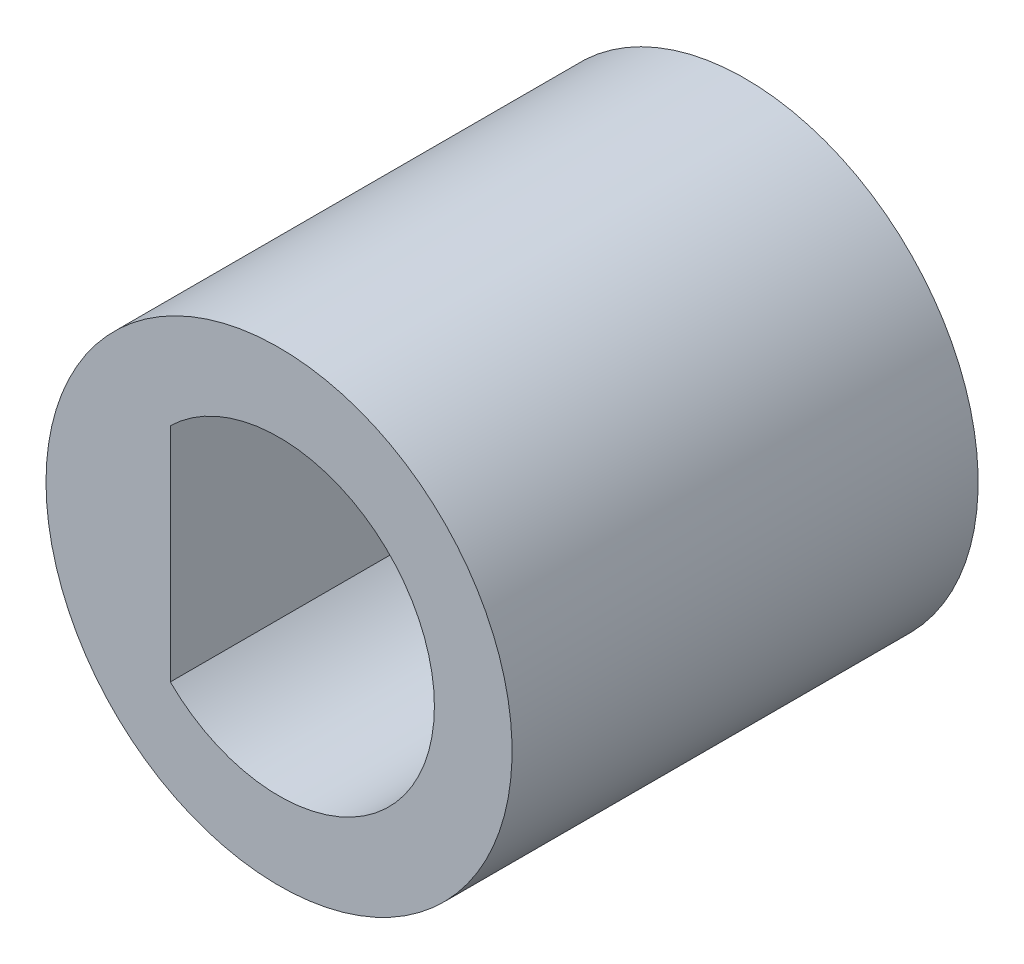
ISO-10303-21;
HEADER;
FILE_DESCRIPTION(('STEP AP214'),'2;1');
FILE_NAME('part.step','',(''),(''),'','','');
FILE_SCHEMA(('AUTOMOTIVE_DESIGN { 1 0 10303 214 1 1 1 1 }'));
ENDSEC;
DATA;
#1=APPLICATION_CONTEXT('core data for automotive mechanical design processes');
#2=APPLICATION_PROTOCOL_DEFINITION('international standard','automotive_design',2000,#1);
#3=PRODUCT_CONTEXT('',#1,'mechanical');
#4=PRODUCT('Part','Part','',(#3));
#5=PRODUCT_RELATED_PRODUCT_CATEGORY('part','',(#4));
#6=PRODUCT_DEFINITION_FORMATION('','',#4);
#7=PRODUCT_DEFINITION_CONTEXT('part definition',#1,'design');
#8=PRODUCT_DEFINITION('design','',#6,#7);
#9=PRODUCT_DEFINITION_SHAPE('','',#8);
#10=(LENGTH_UNIT() NAMED_UNIT(*) SI_UNIT(.MILLI.,.METRE.));
#11=(NAMED_UNIT(*) PLANE_ANGLE_UNIT() SI_UNIT($,.RADIAN.));
#12=(NAMED_UNIT(*) SI_UNIT($,.STERADIAN.) SOLID_ANGLE_UNIT());
#13=UNCERTAINTY_MEASURE_WITH_UNIT(LENGTH_MEASURE(1.E-05),#10,'distance_accuracy_value','');
#14=(GEOMETRIC_REPRESENTATION_CONTEXT(3) GLOBAL_UNCERTAINTY_ASSIGNED_CONTEXT((#13)) GLOBAL_UNIT_ASSIGNED_CONTEXT((#10,
#11,#12)) REPRESENTATION_CONTEXT('',''));
#15=CARTESIAN_POINT('',(0.,0.,0.));
#16=DIRECTION('',(0.,0.,1.));
#17=DIRECTION('',(1.,0.,0.));
#18=AXIS2_PLACEMENT_3D('',#15,#16,#17);
#19=CARTESIAN_POINT('',(0.,0.,9.525));
#20=DIRECTION('',(0.,0.,1.));
#21=DIRECTION('',(1.,0.,0.));
#22=AXIS2_PLACEMENT_3D('',#19,#20,#21);
#23=PLANE('',#22);
#24=CARTESIAN_POINT('',(0.,0.,9.525));
#25=DIRECTION('',(0.,0.,1.));
#26=DIRECTION('',(1.,0.,0.));
#27=AXIS2_PLACEMENT_3D('',#24,#25,#26);
#28=CIRCLE('',#27,4.7625);
#29=CARTESIAN_POINT('',(-4.7625,0.,9.525));
#30=VERTEX_POINT('',#29);
#31=EDGE_CURVE('E11',#30,#30,#28,.T.);
#32=ORIENTED_EDGE('',*,*,#31,.T.);
#33=EDGE_LOOP('',(#32));
#34=FACE_BOUND('',#33,.T.);
#35=DIRECTION('',(0.,-1.,0.));
#36=VECTOR('',#35,1.);
#37=CARTESIAN_POINT('',(-2.2225,-2.26740352606236,9.525));
#38=LINE('',#37,#36);
#39=CARTESIAN_POINT('',(-2.2225,2.26740352606236,9.525));
#40=VERTEX_POINT('',#39);
#41=CARTESIAN_POINT('',(-2.2225,-2.26740352606236,9.525));
#42=VERTEX_POINT('',#41);
#43=EDGE_CURVE('E76',#40,#42,#38,.T.);
#44=ORIENTED_EDGE('',*,*,#43,.F.);
#45=CARTESIAN_POINT('',(0.,0.,9.525));
#46=DIRECTION('',(0.,0.,1.));
#47=DIRECTION('',(1.,0.,0.));
#48=AXIS2_PLACEMENT_3D('',#45,#46,#47);
#49=CIRCLE('',#48,3.175);
#50=EDGE_CURVE('E67',#42,#40,#49,.T.);
#51=ORIENTED_EDGE('',*,*,#50,.F.);
#52=EDGE_LOOP('',(#44,#51));
#53=FACE_BOUND('',#52,.T.);
#54=ADVANCED_FACE('F35',(#34,#53),#23,.T.);
#55=CARTESIAN_POINT('',(0.,0.,0.));
#56=DIRECTION('',(0.,0.,1.));
#57=DIRECTION('',(1.,0.,0.));
#58=AXIS2_PLACEMENT_3D('',#55,#56,#57);
#59=PLANE('',#58);
#60=CARTESIAN_POINT('',(0.,0.,0.));
#61=DIRECTION('',(0.,0.,1.));
#62=DIRECTION('',(1.,0.,0.));
#63=AXIS2_PLACEMENT_3D('',#60,#61,#62);
#64=CIRCLE('',#63,4.7625);
#65=CARTESIAN_POINT('',(-4.7625,0.,0.));
#66=VERTEX_POINT('',#65);
#67=EDGE_CURVE('E39',#66,#66,#64,.T.);
#68=ORIENTED_EDGE('',*,*,#67,.F.);
#69=EDGE_LOOP('',(#68));
#70=FACE_BOUND('',#69,.T.);
#71=CARTESIAN_POINT('',(0.,0.,0.));
#72=DIRECTION('',(0.,0.,1.));
#73=DIRECTION('',(1.,0.,0.));
#74=AXIS2_PLACEMENT_3D('',#71,#72,#73);
#75=CIRCLE('',#74,3.175);
#76=CARTESIAN_POINT('',(-2.2225,-2.26740352606236,0.));
#77=VERTEX_POINT('',#76);
#78=CARTESIAN_POINT('',(-2.2225,2.26740352606236,0.));
#79=VERTEX_POINT('',#78);
#80=EDGE_CURVE('E57',#77,#79,#75,.T.);
#81=ORIENTED_EDGE('',*,*,#80,.T.);
#82=DIRECTION('',(0.,-1.,0.));
#83=VECTOR('',#82,1.);
#84=CARTESIAN_POINT('',(-2.2225,-2.26740352606236,0.));
#85=LINE('',#84,#83);
#86=EDGE_CURVE('E63',#79,#77,#85,.T.);
#87=ORIENTED_EDGE('',*,*,#86,.T.);
#88=EDGE_LOOP('',(#81,#87));
#89=FACE_BOUND('',#88,.T.);
#90=ADVANCED_FACE('F73',(#70,#89),#59,.F.);
#91=CARTESIAN_POINT('',(0.,0.,9.525));
#92=DIRECTION('',(0.,0.,-1.));
#93=DIRECTION('',(-1.,0.,0.));
#94=AXIS2_PLACEMENT_3D('',#91,#92,#93);
#95=CYLINDRICAL_SURFACE('',#94,4.7625);
#96=CARTESIAN_POINT('',(-4.7625,0.,9.525));
#97=CARTESIAN_POINT('',(-4.7625,0.,9.42578125));
#98=CARTESIAN_POINT('',(-4.7625,0.,9.3265625));
#99=CARTESIAN_POINT('',(-4.7625,0.,9.128125));
#100=CARTESIAN_POINT('',(-4.7625,0.,9.02890625));
#101=CARTESIAN_POINT('',(-4.7625,0.,8.83046875));
#102=CARTESIAN_POINT('',(-4.7625,0.,8.73125));
#103=CARTESIAN_POINT('',(-4.7625,0.,8.5328125));
#104=CARTESIAN_POINT('',(-4.7625,0.,8.43359375));
#105=CARTESIAN_POINT('',(-4.7625,0.,8.23515625));
#106=CARTESIAN_POINT('',(-4.7625,0.,8.1359375));
#107=CARTESIAN_POINT('',(-4.7625,0.,7.9375));
#108=CARTESIAN_POINT('',(-4.7625,0.,7.83828125));
#109=CARTESIAN_POINT('',(-4.7625,0.,7.63984375));
#110=CARTESIAN_POINT('',(-4.7625,0.,7.540625));
#111=CARTESIAN_POINT('',(-4.7625,0.,7.3421875));
#112=CARTESIAN_POINT('',(-4.7625,0.,7.24296875));
#113=CARTESIAN_POINT('',(-4.7625,0.,7.04453125));
#114=CARTESIAN_POINT('',(-4.7625,0.,6.9453125));
#115=CARTESIAN_POINT('',(-4.7625,0.,6.746875));
#116=CARTESIAN_POINT('',(-4.7625,0.,6.64765625));
#117=CARTESIAN_POINT('',(-4.7625,0.,6.44921875));
#118=CARTESIAN_POINT('',(-4.7625,0.,6.35));
#119=CARTESIAN_POINT('',(-4.7625,0.,6.1515625));
#120=CARTESIAN_POINT('',(-4.7625,0.,6.05234375));
#121=CARTESIAN_POINT('',(-4.7625,0.,5.85390625));
#122=CARTESIAN_POINT('',(-4.7625,0.,5.7546875));
#123=CARTESIAN_POINT('',(-4.7625,0.,5.55625));
#124=CARTESIAN_POINT('',(-4.7625,0.,5.45703125));
#125=CARTESIAN_POINT('',(-4.7625,0.,5.25859375));
#126=CARTESIAN_POINT('',(-4.7625,0.,5.159375));
#127=CARTESIAN_POINT('',(-4.7625,0.,4.9609375));
#128=CARTESIAN_POINT('',(-4.7625,0.,4.86171875));
#129=CARTESIAN_POINT('',(-4.7625,0.,4.66328125));
#130=CARTESIAN_POINT('',(-4.7625,0.,4.5640625));
#131=CARTESIAN_POINT('',(-4.7625,0.,4.365625));
#132=CARTESIAN_POINT('',(-4.7625,0.,4.26640625));
#133=CARTESIAN_POINT('',(-4.7625,0.,4.06796875));
#134=CARTESIAN_POINT('',(-4.7625,0.,3.96875));
#135=CARTESIAN_POINT('',(-4.7625,0.,3.7703125));
#136=CARTESIAN_POINT('',(-4.7625,0.,3.67109375));
#137=CARTESIAN_POINT('',(-4.7625,0.,3.47265625));
#138=CARTESIAN_POINT('',(-4.7625,0.,3.3734375));
#139=CARTESIAN_POINT('',(-4.7625,0.,3.175));
#140=CARTESIAN_POINT('',(-4.7625,0.,3.07578125));
#141=CARTESIAN_POINT('',(-4.7625,0.,2.87734375));
#142=CARTESIAN_POINT('',(-4.7625,0.,2.778125));
#143=CARTESIAN_POINT('',(-4.7625,0.,2.5796875));
#144=CARTESIAN_POINT('',(-4.7625,0.,2.48046875));
#145=CARTESIAN_POINT('',(-4.7625,0.,2.28203125));
#146=CARTESIAN_POINT('',(-4.7625,0.,2.1828125));
#147=CARTESIAN_POINT('',(-4.7625,0.,1.984375));
#148=CARTESIAN_POINT('',(-4.7625,0.,1.88515625));
#149=CARTESIAN_POINT('',(-4.7625,0.,1.68671875));
#150=CARTESIAN_POINT('',(-4.7625,0.,1.5875));
#151=CARTESIAN_POINT('',(-4.7625,0.,1.3890625));
#152=CARTESIAN_POINT('',(-4.7625,0.,1.28984375));
#153=CARTESIAN_POINT('',(-4.7625,0.,1.09140625));
#154=CARTESIAN_POINT('',(-4.7625,0.,0.992187500000001));
#155=CARTESIAN_POINT('',(-4.7625,0.,0.793750000000001));
#156=CARTESIAN_POINT('',(-4.7625,0.,0.69453125));
#157=CARTESIAN_POINT('',(-4.7625,0.,0.49609375));
#158=CARTESIAN_POINT('',(-4.7625,0.,0.396875));
#159=CARTESIAN_POINT('',(-4.7625,0.,0.1984375));
#160=CARTESIAN_POINT('',(-4.7625,0.,0.0992187500000001));
#161=CARTESIAN_POINT('',(-4.7625,0.,0.));
#162=B_SPLINE_CURVE_WITH_KNOTS('',3,(#96,#97,#98,#99,#100,#101,#102,#103,#104,#105,#106,#107,
#108,#109,#110,#111,#112,#113,#114,#115,#116,#117,#118,#119,#120,#121,#122,#123,#124,#125,#126,
#127,#128,#129,#130,#131,#132,#133,#134,#135,#136,#137,#138,#139,#140,#141,#142,#143,#144,#145,
#146,#147,#148,#149,#150,#151,#152,#153,#154,#155,#156,#157,#158,#159,#160,#161),.UNSPECIFIED.,
.F.,.F.,(4,2,2,2,2,2,2,2,2,2,2,2,2,2,2,2,2,2,2,2,2,2,2,2,2,2,2,2,2,2,2,2,4),(0.,0.29765625,
0.5953125,0.892968750000001,1.190625,1.48828125,1.7859375,2.08359375,2.38125,2.67890625,
2.9765625,3.27421875,3.571875,3.86953125,4.1671875,4.46484375,4.7625,5.06015625,5.3578125,
5.65546875,5.953125,6.25078125,6.5484375,6.84609375,7.14375,7.44140625,7.7390625,8.03671875,
8.334375,8.63203125,8.9296875,9.22734375,9.525),.UNSPECIFIED.);
#163=EDGE_CURVE('BSEAM37',#30,#66,#162,.T.);
#164=ORIENTED_EDGE('',*,*,#31,.F.);
#165=ORIENTED_EDGE('',*,*,#67,.T.);
#166=ORIENTED_EDGE('',*,*,#163,.T.);
#167=ORIENTED_EDGE('',*,*,#163,.F.);
#168=EDGE_LOOP('',(#164,#166,#165,#167));
#169=FACE_BOUND('',#168,.T.);
#170=ADVANCED_FACE('F37',(#169),#95,.T.);
#171=CARTESIAN_POINT('',(0.,0.,9.525));
#172=DIRECTION('',(0.,0.,-1.));
#173=DIRECTION('',(-1.,0.,0.));
#174=AXIS2_PLACEMENT_3D('',#171,#172,#173);
#175=CYLINDRICAL_SURFACE('',#174,3.175);
#176=ORIENTED_EDGE('',*,*,#80,.F.);
#177=DIRECTION('',(0.,0.,-1.));
#178=VECTOR('',#177,1.);
#179=CARTESIAN_POINT('',(-2.2225,-2.26740352606236,9.525));
#180=LINE('',#179,#178);
#181=EDGE_CURVE('E65',#42,#77,#180,.T.);
#182=ORIENTED_EDGE('',*,*,#181,.F.);
#183=ORIENTED_EDGE('',*,*,#50,.T.);
#184=DIRECTION('',(0.,0.,-1.));
#185=VECTOR('',#184,1.);
#186=CARTESIAN_POINT('',(-2.2225,2.26740352606236,9.525));
#187=LINE('',#186,#185);
#188=EDGE_CURVE('E50',#40,#79,#187,.T.);
#189=ORIENTED_EDGE('',*,*,#188,.T.);
#190=EDGE_LOOP('',(#176,#182,#183,#189));
#191=FACE_BOUND('',#190,.T.);
#192=ADVANCED_FACE('F69',(#191),#175,.F.);
#193=CARTESIAN_POINT('',(-2.2225,-2.26740352606236,9.525));
#194=DIRECTION('',(1.,0.,0.));
#195=DIRECTION('',(0.,0.,-1.));
#196=AXIS2_PLACEMENT_3D('',#193,#194,#195);
#197=PLANE('',#196);
#198=ORIENTED_EDGE('',*,*,#86,.F.);
#199=ORIENTED_EDGE('',*,*,#188,.F.);
#200=ORIENTED_EDGE('',*,*,#43,.T.);
#201=ORIENTED_EDGE('',*,*,#181,.T.);
#202=EDGE_LOOP('',(#198,#199,#200,#201));
#203=FACE_BOUND('',#202,.T.);
#204=ADVANCED_FACE('F64',(#203),#197,.T.);
#205=CLOSED_SHELL('',(#54,#90,#170,#192,#204));
#206=MANIFOLD_SOLID_BREP('B2',#205);
#207=ADVANCED_BREP_SHAPE_REPRESENTATION('',(#18,#206),#14);
#208=SHAPE_DEFINITION_REPRESENTATION(#9,#207);
ENDSEC;
END-ISO-10303-21;
